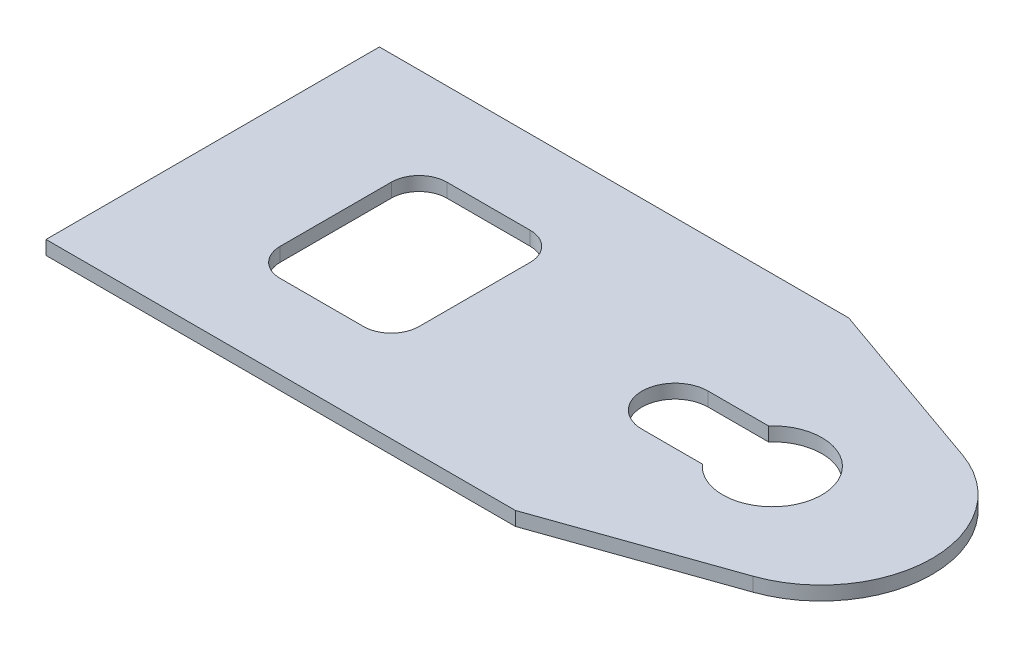
ISO-10303-21;
HEADER;
FILE_DESCRIPTION(('STEP AP214'),'2;1');
FILE_NAME('part.step','',(''),(''),'','','');
FILE_SCHEMA(('AUTOMOTIVE_DESIGN { 1 0 10303 214 1 1 1 1 }'));
ENDSEC;
DATA;
#1=APPLICATION_CONTEXT('core data for automotive mechanical design processes');
#2=APPLICATION_PROTOCOL_DEFINITION('international standard','automotive_design',2000,#1);
#3=PRODUCT_CONTEXT('',#1,'mechanical');
#4=PRODUCT('Part','Part','',(#3));
#5=PRODUCT_RELATED_PRODUCT_CATEGORY('part','',(#4));
#6=PRODUCT_DEFINITION_FORMATION('','',#4);
#7=PRODUCT_DEFINITION_CONTEXT('part definition',#1,'design');
#8=PRODUCT_DEFINITION('design','',#6,#7);
#9=PRODUCT_DEFINITION_SHAPE('','',#8);
#10=(LENGTH_UNIT() NAMED_UNIT(*) SI_UNIT(.MILLI.,.METRE.));
#11=(NAMED_UNIT(*) PLANE_ANGLE_UNIT() SI_UNIT($,.RADIAN.));
#12=(NAMED_UNIT(*) SI_UNIT($,.STERADIAN.) SOLID_ANGLE_UNIT());
#13=UNCERTAINTY_MEASURE_WITH_UNIT(LENGTH_MEASURE(1.E-05),#10,'distance_accuracy_value','');
#14=(GEOMETRIC_REPRESENTATION_CONTEXT(3) GLOBAL_UNCERTAINTY_ASSIGNED_CONTEXT((#13)) GLOBAL_UNIT_ASSIGNED_CONTEXT((#10,
#11,#12)) REPRESENTATION_CONTEXT('',''));
#15=CARTESIAN_POINT('',(0.,0.,0.));
#16=DIRECTION('',(0.,0.,1.));
#17=DIRECTION('',(1.,0.,0.));
#18=AXIS2_PLACEMENT_3D('',#15,#16,#17);
#19=CARTESIAN_POINT('',(1.07300918301274,0.,12.));
#20=DIRECTION('',(0.,0.,1.));
#21=DIRECTION('',(0.,1.,0.));
#22=AXIS2_PLACEMENT_3D('',#19,#20,#21);
#23=PLANE('',#22);
#24=DIRECTION('',(-1.,0.,0.));
#25=VECTOR('',#24,1.);
#26=CARTESIAN_POINT('',(2.07300918301273,1.00000000000002,12.));
#27=LINE('',#26,#25);
#28=CARTESIAN_POINT('',(-22.7831853071796,0.999999999999828,12.));
#29=VERTEX_POINT('',#28);
#30=CARTESIAN_POINT('',(11.,1.,12.));
#31=VERTEX_POINT('',#30);
#32=EDGE_CURVE('E292',#29,#31,#27,.F.);
#33=ORIENTED_EDGE('',*,*,#32,.F.);
#34=DIRECTION('',(0.,-1.,0.));
#35=VECTOR('',#34,1.);
#36=CARTESIAN_POINT('',(-22.7831853071796,-1.71786389540026E-13,12.));
#37=LINE('',#36,#35);
#38=CARTESIAN_POINT('',(-22.7831853071796,-1.71786389540026E-13,12.));
#39=VERTEX_POINT('',#38);
#40=EDGE_CURVE('E193',#29,#39,#37,.T.);
#41=ORIENTED_EDGE('',*,*,#40,.T.);
#42=DIRECTION('',(1.,0.,0.));
#43=VECTOR('',#42,1.);
#44=CARTESIAN_POINT('',(1.07300918301274,0.,12.));
#45=LINE('',#44,#43);
#46=CARTESIAN_POINT('',(11.,0.,12.));
#47=VERTEX_POINT('',#46);
#48=EDGE_CURVE('E13',#39,#47,#45,.T.);
#49=ORIENTED_EDGE('',*,*,#48,.T.);
#50=DIRECTION('',(0.,-1.,0.));
#51=VECTOR('',#50,1.);
#52=CARTESIAN_POINT('',(11.,1.,12.));
#53=LINE('',#52,#51);
#54=EDGE_CURVE('E190',#31,#47,#53,.T.);
#55=ORIENTED_EDGE('',*,*,#54,.F.);
#56=EDGE_LOOP('',(#33,#41,#49,#55));
#57=FACE_BOUND('',#56,.T.);
#58=ADVANCED_FACE('F63',(#57),#23,.T.);
#59=CARTESIAN_POINT('',(-18.9269908169873,-1.25796493264004E-13,-12.));
#60=DIRECTION('',(0.,0.,-1.));
#61=DIRECTION('',(0.,-1.,0.));
#62=AXIS2_PLACEMENT_3D('',#59,#60,#61);
#63=PLANE('',#62);
#64=DIRECTION('',(-1.,0.,0.));
#65=VECTOR('',#64,1.);
#66=CARTESIAN_POINT('',(-18.9269908169873,-1.2582553451969E-13,-12.));
#67=LINE('',#66,#65);
#68=CARTESIAN_POINT('',(11.,0.,-12.));
#69=VERTEX_POINT('',#68);
#70=CARTESIAN_POINT('',(-22.7831853071796,-1.71786389540026E-13,-12.));
#71=VERTEX_POINT('',#70);
#72=EDGE_CURVE('E72',#69,#71,#67,.T.);
#73=ORIENTED_EDGE('',*,*,#72,.T.);
#74=DIRECTION('',(0.,-1.,0.));
#75=VECTOR('',#74,1.);
#76=CARTESIAN_POINT('',(-22.7831853071796,-1.71786389540026E-13,-12.));
#77=LINE('',#76,#75);
#78=CARTESIAN_POINT('',(-22.7831853071796,0.999999999999828,-12.));
#79=VERTEX_POINT('',#78);
#80=EDGE_CURVE('E228',#79,#71,#77,.T.);
#81=ORIENTED_EDGE('',*,*,#80,.F.);
#82=DIRECTION('',(1.,0.,0.));
#83=VECTOR('',#82,1.);
#84=CARTESIAN_POINT('',(2.07300918301273,1.00000000000002,-12.));
#85=LINE('',#84,#83);
#86=CARTESIAN_POINT('',(11.,1.,-12.));
#87=VERTEX_POINT('',#86);
#88=EDGE_CURVE('E67',#87,#79,#85,.F.);
#89=ORIENTED_EDGE('',*,*,#88,.F.);
#90=DIRECTION('',(0.,-1.,0.));
#91=VECTOR('',#90,1.);
#92=CARTESIAN_POINT('',(11.,1.,-12.));
#93=LINE('',#92,#91);
#94=EDGE_CURVE('E231',#87,#69,#93,.T.);
#95=ORIENTED_EDGE('',*,*,#94,.T.);
#96=EDGE_LOOP('',(#73,#81,#89,#95));
#97=FACE_BOUND('',#96,.T.);
#98=ADVANCED_FACE('F304',(#97),#63,.T.);
#99=CARTESIAN_POINT('',(21.,0.,0.));
#100=DIRECTION('',(0.,-1.,0.));
#101=DIRECTION('',(0.,0.,-1.));
#102=AXIS2_PLACEMENT_3D('',#99,#100,#101);
#103=PLANE('',#102);
#104=CARTESIAN_POINT('',(-11.9269908169872,-1.45808412964008E-13,-4.));
#105=DIRECTION('',(0.,1.,0.));
#106=DIRECTION('',(1.,0.,0.));
#107=AXIS2_PLACEMENT_3D('',#104,#105,#106);
#108=CIRCLE('',#107,2.);
#109=CARTESIAN_POINT('',(-11.9269908169872,-1.45808412964008E-13,-6.));
#110=VERTEX_POINT('',#109);
#111=CARTESIAN_POINT('',(-13.9269908169872,-1.59947109980098E-13,-3.99999999999998));
#112=VERTEX_POINT('',#111);
#113=EDGE_CURVE('E232',#110,#112,#108,.T.);
#114=ORIENTED_EDGE('',*,*,#113,.T.);
#115=DIRECTION('',(0.,0.,1.));
#116=VECTOR('',#115,1.);
#117=CARTESIAN_POINT('',(-13.9269908169872,-1.59947109980098E-13,3.99999999999999));
#118=LINE('',#117,#116);
#119=CARTESIAN_POINT('',(-13.9269908169872,0.,3.99999999999999));
#120=VERTEX_POINT('',#119);
#121=EDGE_CURVE('E235',#112,#120,#118,.T.);
#122=ORIENTED_EDGE('',*,*,#121,.T.);
#123=CARTESIAN_POINT('',(-11.9269908169872,-1.45808412964008E-13,4.));
#124=DIRECTION('',(0.,1.,0.));
#125=DIRECTION('',(-1.,0.,0.));
#126=AXIS2_PLACEMENT_3D('',#123,#124,#125);
#127=CIRCLE('',#126,2.);
#128=CARTESIAN_POINT('',(-11.9269908169872,-1.45808412964008E-13,6.));
#129=VERTEX_POINT('',#128);
#130=EDGE_CURVE('E80',#120,#129,#127,.T.);
#131=ORIENTED_EDGE('',*,*,#130,.T.);
#132=DIRECTION('',(1.,0.,0.));
#133=VECTOR('',#132,1.);
#134=CARTESIAN_POINT('',(-11.9269908169872,-1.45808412964008E-13,6.));
#135=LINE('',#134,#133);
#136=CARTESIAN_POINT('',(-5.92699081698719,-1.04042843219227E-13,6.));
#137=VERTEX_POINT('',#136);
#138=EDGE_CURVE('E240',#129,#137,#135,.T.);
#139=ORIENTED_EDGE('',*,*,#138,.T.);
#140=CARTESIAN_POINT('',(-5.92699081698718,-1.04042843219227E-13,4.));
#141=DIRECTION('',(0.,1.,0.));
#142=DIRECTION('',(-1.,0.,0.));
#143=AXIS2_PLACEMENT_3D('',#140,#141,#142);
#144=CIRCLE('',#143,2.);
#145=CARTESIAN_POINT('',(-3.92699081698718,0.,3.99999999999999));
#146=VERTEX_POINT('',#145);
#147=EDGE_CURVE('E243',#137,#146,#144,.T.);
#148=ORIENTED_EDGE('',*,*,#147,.T.);
#149=DIRECTION('',(0.,0.,-1.));
#150=VECTOR('',#149,1.);
#151=CARTESIAN_POINT('',(-3.92699081698718,0.,3.99999999999999));
#152=LINE('',#151,#150);
#153=CARTESIAN_POINT('',(-3.92699081698718,0.,-3.99999999999998));
#154=VERTEX_POINT('',#153);
#155=EDGE_CURVE('E246',#146,#154,#152,.T.);
#156=ORIENTED_EDGE('',*,*,#155,.T.);
#157=CARTESIAN_POINT('',(-5.92699081698718,-1.04042843219227E-13,-4.));
#158=DIRECTION('',(0.,1.,0.));
#159=DIRECTION('',(-1.,0.,0.));
#160=AXIS2_PLACEMENT_3D('',#157,#158,#159);
#161=CIRCLE('',#160,2.);
#162=CARTESIAN_POINT('',(-5.92699081698719,-1.04042843219227E-13,-6.));
#163=VERTEX_POINT('',#162);
#164=EDGE_CURVE('E249',#154,#163,#161,.T.);
#165=ORIENTED_EDGE('',*,*,#164,.T.);
#166=DIRECTION('',(-1.,0.,0.));
#167=VECTOR('',#166,1.);
#168=CARTESIAN_POINT('',(-11.9269908169872,-1.45808412964008E-13,-6.));
#169=LINE('',#168,#167);
#170=EDGE_CURVE('E252',#163,#110,#169,.T.);
#171=ORIENTED_EDGE('',*,*,#170,.T.);
#172=EDGE_LOOP('',(#114,#122,#131,#139,#148,#156,#165,#171));
#173=FACE_BOUND('',#172,.T.);
#174=ORIENTED_EDGE('',*,*,#48,.F.);
#175=DIRECTION('',(0.,0.,1.));
#176=VECTOR('',#175,1.);
#177=CARTESIAN_POINT('',(-22.7831853071796,-1.71786389540026E-13,0.));
#178=LINE('',#177,#176);
#179=EDGE_CURVE('E226',#71,#39,#178,.T.);
#180=ORIENTED_EDGE('',*,*,#179,.F.);
#181=ORIENTED_EDGE('',*,*,#72,.F.);
#182=DIRECTION('',(-0.943295404303227,0.,-0.331954485163872));
#183=VECTOR('',#182,1.);
#184=CARTESIAN_POINT('',(11.,0.,-12.));
#185=LINE('',#184,#183);
#186=CARTESIAN_POINT('',(23.655635881311,0.,-7.54636323442582));
#187=VERTEX_POINT('',#186);
#188=EDGE_CURVE('E219',#187,#69,#185,.T.);
#189=ORIENTED_EDGE('',*,*,#188,.F.);
#190=CARTESIAN_POINT('',(21.,0.,0.));
#191=DIRECTION('',(0.,1.,0.));
#192=DIRECTION('',(0.,0.,-1.));
#193=AXIS2_PLACEMENT_3D('',#190,#191,#192);
#194=CIRCLE('',#193,8.);
#195=CARTESIAN_POINT('',(23.655635881311,0.,7.54636323442582));
#196=VERTEX_POINT('',#195);
#197=EDGE_CURVE('E209',#196,#187,#194,.T.);
#198=ORIENTED_EDGE('',*,*,#197,.F.);
#199=DIRECTION('',(0.943295404303227,0.,-0.331954485163872));
#200=VECTOR('',#199,1.);
#201=CARTESIAN_POINT('',(23.655635881311,0.,7.54636323442582));
#202=LINE('',#201,#200);
#203=EDGE_CURVE('E201',#47,#196,#202,.T.);
#204=ORIENTED_EDGE('',*,*,#203,.F.);
#205=EDGE_LOOP('',(#174,#180,#181,#189,#198,#204));
#206=FACE_BOUND('',#205,.T.);
#207=CARTESIAN_POINT('',(10.5,0.,0.));
#208=DIRECTION('',(0.,1.,0.));
#209=DIRECTION('',(0.,0.,1.));
#210=AXIS2_PLACEMENT_3D('',#207,#208,#209);
#211=CIRCLE('',#210,2.38);
#212=CARTESIAN_POINT('',(10.5,0.,-2.38));
#213=VERTEX_POINT('',#212);
#214=CARTESIAN_POINT('',(10.5,0.,2.38));
#215=VERTEX_POINT('',#214);
#216=EDGE_CURVE('E321',#213,#215,#211,.T.);
#217=ORIENTED_EDGE('',*,*,#216,.T.);
#218=DIRECTION('',(1.,0.,0.));
#219=VECTOR('',#218,1.);
#220=CARTESIAN_POINT('',(10.5,0.,2.38));
#221=LINE('',#220,#219);
#222=CARTESIAN_POINT('',(14.8390791067753,0.,2.38));
#223=VERTEX_POINT('',#222);
#224=EDGE_CURVE('E318',#215,#223,#221,.T.);
#225=ORIENTED_EDGE('',*,*,#224,.T.);
#226=CARTESIAN_POINT('',(17.5,0.,0.));
#227=DIRECTION('',(0.,1.,0.));
#228=DIRECTION('',(0.,0.,1.));
#229=AXIS2_PLACEMENT_3D('',#226,#227,#228);
#230=CIRCLE('',#229,3.57);
#231=CARTESIAN_POINT('',(14.8390791067753,0.,-2.38));
#232=VERTEX_POINT('',#231);
#233=EDGE_CURVE('E313',#223,#232,#230,.T.);
#234=ORIENTED_EDGE('',*,*,#233,.T.);
#235=DIRECTION('',(-1.,0.,0.));
#236=VECTOR('',#235,1.);
#237=CARTESIAN_POINT('',(10.5,0.,-2.38));
#238=LINE('',#237,#236);
#239=EDGE_CURVE('E310',#232,#213,#238,.T.);
#240=ORIENTED_EDGE('',*,*,#239,.T.);
#241=EDGE_LOOP('',(#217,#225,#234,#240));
#242=FACE_BOUND('',#241,.T.);
#243=ADVANCED_FACE('F65',(#173,#206,#242),#103,.T.);
#244=CARTESIAN_POINT('',(2.07300918301273,1.00000000000002,0.));
#245=DIRECTION('',(0.,-1.,0.));
#246=DIRECTION('',(1.,0.,0.));
#247=AXIS2_PLACEMENT_3D('',#244,#245,#246);
#248=PLANE('',#247);
#249=DIRECTION('',(0.,0.,1.));
#250=VECTOR('',#249,1.);
#251=CARTESIAN_POINT('',(-13.9269908169872,0.999999999999909,3.99999999999999));
#252=LINE('',#251,#250);
#253=CARTESIAN_POINT('',(-13.9269908169872,0.999999999999909,-3.99999999999998));
#254=VERTEX_POINT('',#253);
#255=CARTESIAN_POINT('',(-13.9269908169872,0.999999999999909,3.99999999999999));
#256=VERTEX_POINT('',#255);
#257=EDGE_CURVE('E257',#254,#256,#252,.T.);
#258=ORIENTED_EDGE('',*,*,#257,.F.);
#259=CARTESIAN_POINT('',(-11.9269908169872,0.999999999999923,-4.));
#260=DIRECTION('',(0.,1.,0.));
#261=DIRECTION('',(1.,0.,0.));
#262=AXIS2_PLACEMENT_3D('',#259,#260,#261);
#263=CIRCLE('',#262,2.);
#264=CARTESIAN_POINT('',(-11.9269908169872,0.999999999999923,-6.));
#265=VERTEX_POINT('',#264);
#266=EDGE_CURVE('E88',#265,#254,#263,.T.);
#267=ORIENTED_EDGE('',*,*,#266,.F.);
#268=DIRECTION('',(-1.,0.,0.));
#269=VECTOR('',#268,1.);
#270=CARTESIAN_POINT('',(-11.9269908169872,0.999999999999923,-6.));
#271=LINE('',#270,#269);
#272=CARTESIAN_POINT('',(-5.9269908169872,0.999999999999965,-6.));
#273=VERTEX_POINT('',#272);
#274=EDGE_CURVE('E236',#273,#265,#271,.T.);
#275=ORIENTED_EDGE('',*,*,#274,.F.);
#276=CARTESIAN_POINT('',(-5.92699081698718,0.999999999999965,-4.));
#277=DIRECTION('',(0.,1.,0.));
#278=DIRECTION('',(-1.,0.,0.));
#279=AXIS2_PLACEMENT_3D('',#276,#277,#278);
#280=CIRCLE('',#279,2.);
#281=CARTESIAN_POINT('',(-3.92699081698718,0.999999999999979,-3.99999999999998));
#282=VERTEX_POINT('',#281);
#283=EDGE_CURVE('E272',#282,#273,#280,.T.);
#284=ORIENTED_EDGE('',*,*,#283,.F.);
#285=DIRECTION('',(0.,0.,-1.));
#286=VECTOR('',#285,1.);
#287=CARTESIAN_POINT('',(-3.92699081698718,0.999999999999979,3.99999999999999));
#288=LINE('',#287,#286);
#289=CARTESIAN_POINT('',(-3.92699081698718,0.999999999999979,3.99999999999999));
#290=VERTEX_POINT('',#289);
#291=EDGE_CURVE('E269',#290,#282,#288,.T.);
#292=ORIENTED_EDGE('',*,*,#291,.F.);
#293=CARTESIAN_POINT('',(-5.92699081698718,0.999999999999965,4.));
#294=DIRECTION('',(0.,1.,0.));
#295=DIRECTION('',(-1.,0.,0.));
#296=AXIS2_PLACEMENT_3D('',#293,#294,#295);
#297=CIRCLE('',#296,2.);
#298=CARTESIAN_POINT('',(-5.9269908169872,0.999999999999965,6.));
#299=VERTEX_POINT('',#298);
#300=EDGE_CURVE('E266',#299,#290,#297,.T.);
#301=ORIENTED_EDGE('',*,*,#300,.F.);
#302=DIRECTION('',(1.,0.,0.));
#303=VECTOR('',#302,1.);
#304=CARTESIAN_POINT('',(-11.9269908169872,0.999999999999923,6.));
#305=LINE('',#304,#303);
#306=CARTESIAN_POINT('',(-11.9269908169872,0.999999999999923,6.));
#307=VERTEX_POINT('',#306);
#308=EDGE_CURVE('E263',#307,#299,#305,.T.);
#309=ORIENTED_EDGE('',*,*,#308,.F.);
#310=CARTESIAN_POINT('',(-11.9269908169872,0.999999999999923,4.));
#311=DIRECTION('',(0.,1.,0.));
#312=DIRECTION('',(-1.,0.,0.));
#313=AXIS2_PLACEMENT_3D('',#310,#311,#312);
#314=CIRCLE('',#313,2.);
#315=EDGE_CURVE('E260',#256,#307,#314,.T.);
#316=ORIENTED_EDGE('',*,*,#315,.F.);
#317=EDGE_LOOP('',(#258,#267,#275,#284,#292,#301,#309,#316));
#318=FACE_BOUND('',#317,.T.);
#319=ORIENTED_EDGE('',*,*,#88,.T.);
#320=DIRECTION('',(0.,0.,1.));
#321=VECTOR('',#320,1.);
#322=CARTESIAN_POINT('',(-22.7831853071796,0.999999999999828,0.));
#323=LINE('',#322,#321);
#324=EDGE_CURVE('E223',#79,#29,#323,.T.);
#325=ORIENTED_EDGE('',*,*,#324,.T.);
#326=ORIENTED_EDGE('',*,*,#32,.T.);
#327=DIRECTION('',(0.943295404303227,0.,-0.331954485163872));
#328=VECTOR('',#327,1.);
#329=CARTESIAN_POINT('',(23.655635881311,1.,7.54636323442582));
#330=LINE('',#329,#328);
#331=CARTESIAN_POINT('',(23.655635881311,1.,7.54636323442582));
#332=VERTEX_POINT('',#331);
#333=EDGE_CURVE('E203',#31,#332,#330,.T.);
#334=ORIENTED_EDGE('',*,*,#333,.T.);
#335=CARTESIAN_POINT('',(21.,1.,0.));
#336=DIRECTION('',(0.,1.,0.));
#337=DIRECTION('',(0.,0.,-1.));
#338=AXIS2_PLACEMENT_3D('',#335,#336,#337);
#339=CIRCLE('',#338,8.);
#340=CARTESIAN_POINT('',(23.655635881311,1.,-7.54636323442582));
#341=VERTEX_POINT('',#340);
#342=EDGE_CURVE('E325',#332,#341,#339,.T.);
#343=ORIENTED_EDGE('',*,*,#342,.T.);
#344=DIRECTION('',(-0.943295404303227,0.,-0.331954485163872));
#345=VECTOR('',#344,1.);
#346=CARTESIAN_POINT('',(11.,1.,-12.));
#347=LINE('',#346,#345);
#348=EDGE_CURVE('E300',#341,#87,#347,.T.);
#349=ORIENTED_EDGE('',*,*,#348,.T.);
#350=EDGE_LOOP('',(#319,#325,#326,#334,#343,#349));
#351=FACE_BOUND('',#350,.T.);
#352=DIRECTION('',(1.,0.,0.));
#353=VECTOR('',#352,1.);
#354=CARTESIAN_POINT('',(10.5,1.,2.38));
#355=LINE('',#354,#353);
#356=CARTESIAN_POINT('',(10.5,1.,2.38));
#357=VERTEX_POINT('',#356);
#358=CARTESIAN_POINT('',(14.8390791067753,1.,2.38));
#359=VERTEX_POINT('',#358);
#360=EDGE_CURVE('E331',#357,#359,#355,.T.);
#361=ORIENTED_EDGE('',*,*,#360,.F.);
#362=CARTESIAN_POINT('',(10.5,1.,0.));
#363=DIRECTION('',(0.,1.,0.));
#364=DIRECTION('',(0.,0.,1.));
#365=AXIS2_PLACEMENT_3D('',#362,#363,#364);
#366=CIRCLE('',#365,2.38);
#367=CARTESIAN_POINT('',(10.5,1.,-2.38));
#368=VERTEX_POINT('',#367);
#369=EDGE_CURVE('E336',#368,#357,#366,.T.);
#370=ORIENTED_EDGE('',*,*,#369,.F.);
#371=DIRECTION('',(-1.,0.,0.));
#372=VECTOR('',#371,1.);
#373=CARTESIAN_POINT('',(10.5,1.,-2.38));
#374=LINE('',#373,#372);
#375=CARTESIAN_POINT('',(14.8390791067753,1.,-2.38));
#376=VERTEX_POINT('',#375);
#377=EDGE_CURVE('E340',#376,#368,#374,.T.);
#378=ORIENTED_EDGE('',*,*,#377,.F.);
#379=CARTESIAN_POINT('',(17.5,1.,0.));
#380=DIRECTION('',(0.,1.,0.));
#381=DIRECTION('',(0.,0.,1.));
#382=AXIS2_PLACEMENT_3D('',#379,#380,#381);
#383=CIRCLE('',#382,3.57);
#384=EDGE_CURVE('E204',#359,#376,#383,.T.);
#385=ORIENTED_EDGE('',*,*,#384,.F.);
#386=EDGE_LOOP('',(#361,#370,#378,#385));
#387=FACE_BOUND('',#386,.T.);
#388=ADVANCED_FACE('F296',(#318,#351,#387),#248,.F.);
#389=CARTESIAN_POINT('',(-11.9269908169872,-1.45808412964008E-13,-4.));
#390=DIRECTION('',(0.,1.,0.));
#391=DIRECTION('',(-1.,0.,0.));
#392=AXIS2_PLACEMENT_3D('',#389,#390,#391);
#393=CYLINDRICAL_SURFACE('',#392,2.);
#394=ORIENTED_EDGE('',*,*,#266,.T.);
#395=DIRECTION('',(0.,1.,0.));
#396=VECTOR('',#395,1.);
#397=CARTESIAN_POINT('',(-13.9269908169872,-1.59947109980098E-13,-3.99999999999998));
#398=LINE('',#397,#396);
#399=EDGE_CURVE('E255',#112,#254,#398,.T.);
#400=ORIENTED_EDGE('',*,*,#399,.F.);
#401=ORIENTED_EDGE('',*,*,#113,.F.);
#402=DIRECTION('',(0.,1.,0.));
#403=VECTOR('',#402,1.);
#404=CARTESIAN_POINT('',(-11.9269908169872,-1.45808412964008E-13,-6.));
#405=LINE('',#404,#403);
#406=EDGE_CURVE('E277',#110,#265,#405,.T.);
#407=ORIENTED_EDGE('',*,*,#406,.T.);
#408=EDGE_LOOP('',(#394,#400,#401,#407));
#409=FACE_BOUND('',#408,.T.);
#410=ADVANCED_FACE('F377',(#409),#393,.F.);
#411=CARTESIAN_POINT('',(-11.9269908169872,-1.45808412964008E-13,-6.));
#412=DIRECTION('',(0.,0.,-1.));
#413=DIRECTION('',(-1.,0.,0.));
#414=AXIS2_PLACEMENT_3D('',#411,#412,#413);
#415=PLANE('',#414);
#416=ORIENTED_EDGE('',*,*,#274,.T.);
#417=ORIENTED_EDGE('',*,*,#406,.F.);
#418=ORIENTED_EDGE('',*,*,#170,.F.);
#419=DIRECTION('',(0.,1.,0.));
#420=VECTOR('',#419,1.);
#421=CARTESIAN_POINT('',(-5.92699081698719,-1.04042843219227E-13,-6.));
#422=LINE('',#421,#420);
#423=EDGE_CURVE('E279',#163,#273,#422,.T.);
#424=ORIENTED_EDGE('',*,*,#423,.T.);
#425=EDGE_LOOP('',(#416,#417,#418,#424));
#426=FACE_BOUND('',#425,.T.);
#427=ADVANCED_FACE('F381',(#426),#415,.F.);
#428=CARTESIAN_POINT('',(-5.92699081698718,-1.04042843219227E-13,-4.));
#429=DIRECTION('',(0.,1.,0.));
#430=DIRECTION('',(-1.,0.,0.));
#431=AXIS2_PLACEMENT_3D('',#428,#429,#430);
#432=CYLINDRICAL_SURFACE('',#431,2.);
#433=ORIENTED_EDGE('',*,*,#283,.T.);
#434=ORIENTED_EDGE('',*,*,#423,.F.);
#435=ORIENTED_EDGE('',*,*,#164,.F.);
#436=DIRECTION('',(0.,1.,0.));
#437=VECTOR('',#436,1.);
#438=CARTESIAN_POINT('',(-3.92699081698718,0.,-3.99999999999998));
#439=LINE('',#438,#437);
#440=EDGE_CURVE('E281',#154,#282,#439,.T.);
#441=ORIENTED_EDGE('',*,*,#440,.T.);
#442=EDGE_LOOP('',(#433,#434,#435,#441));
#443=FACE_BOUND('',#442,.T.);
#444=ADVANCED_FACE('F400',(#443),#432,.F.);
#445=CARTESIAN_POINT('',(-3.92699081698718,0.,3.99999999999999));
#446=DIRECTION('',(1.,0.,0.));
#447=DIRECTION('',(0.,1.,0.));
#448=AXIS2_PLACEMENT_3D('',#445,#446,#447);
#449=PLANE('',#448);
#450=ORIENTED_EDGE('',*,*,#291,.T.);
#451=ORIENTED_EDGE('',*,*,#440,.F.);
#452=ORIENTED_EDGE('',*,*,#155,.F.);
#453=DIRECTION('',(0.,1.,0.));
#454=VECTOR('',#453,1.);
#455=CARTESIAN_POINT('',(-3.92699081698718,0.,3.99999999999999));
#456=LINE('',#455,#454);
#457=EDGE_CURVE('E283',#146,#290,#456,.T.);
#458=ORIENTED_EDGE('',*,*,#457,.T.);
#459=EDGE_LOOP('',(#450,#451,#452,#458));
#460=FACE_BOUND('',#459,.T.);
#461=ADVANCED_FACE('F396',(#460),#449,.F.);
#462=CARTESIAN_POINT('',(-5.92699081698718,-1.04042843219227E-13,4.));
#463=DIRECTION('',(0.,1.,0.));
#464=DIRECTION('',(-1.,0.,0.));
#465=AXIS2_PLACEMENT_3D('',#462,#463,#464);
#466=CYLINDRICAL_SURFACE('',#465,2.);
#467=ORIENTED_EDGE('',*,*,#300,.T.);
#468=ORIENTED_EDGE('',*,*,#457,.F.);
#469=ORIENTED_EDGE('',*,*,#147,.F.);
#470=DIRECTION('',(0.,1.,0.));
#471=VECTOR('',#470,1.);
#472=CARTESIAN_POINT('',(-5.92699081698719,-1.04042843219227E-13,6.));
#473=LINE('',#472,#471);
#474=EDGE_CURVE('E285',#137,#299,#473,.T.);
#475=ORIENTED_EDGE('',*,*,#474,.T.);
#476=EDGE_LOOP('',(#467,#468,#469,#475));
#477=FACE_BOUND('',#476,.T.);
#478=ADVANCED_FACE('F392',(#477),#466,.F.);
#479=CARTESIAN_POINT('',(-11.9269908169872,-1.45808412964008E-13,6.));
#480=DIRECTION('',(0.,0.,1.));
#481=DIRECTION('',(1.,0.,0.));
#482=AXIS2_PLACEMENT_3D('',#479,#480,#481);
#483=PLANE('',#482);
#484=ORIENTED_EDGE('',*,*,#308,.T.);
#485=ORIENTED_EDGE('',*,*,#474,.F.);
#486=ORIENTED_EDGE('',*,*,#138,.F.);
#487=DIRECTION('',(0.,1.,0.));
#488=VECTOR('',#487,1.);
#489=CARTESIAN_POINT('',(-11.9269908169872,-1.45808412964008E-13,6.));
#490=LINE('',#489,#488);
#491=EDGE_CURVE('E287',#129,#307,#490,.T.);
#492=ORIENTED_EDGE('',*,*,#491,.T.);
#493=EDGE_LOOP('',(#484,#485,#486,#492));
#494=FACE_BOUND('',#493,.T.);
#495=ADVANCED_FACE('F389',(#494),#483,.F.);
#496=CARTESIAN_POINT('',(-11.9269908169872,-1.45808412964008E-13,4.));
#497=DIRECTION('',(0.,1.,0.));
#498=DIRECTION('',(-1.,0.,0.));
#499=AXIS2_PLACEMENT_3D('',#496,#497,#498);
#500=CYLINDRICAL_SURFACE('',#499,2.);
#501=ORIENTED_EDGE('',*,*,#315,.T.);
#502=ORIENTED_EDGE('',*,*,#491,.F.);
#503=ORIENTED_EDGE('',*,*,#130,.F.);
#504=DIRECTION('',(0.,1.,0.));
#505=VECTOR('',#504,1.);
#506=CARTESIAN_POINT('',(-13.9269908169872,-1.59947109980098E-13,3.99999999999999));
#507=LINE('',#506,#505);
#508=EDGE_CURVE('E289',#120,#256,#507,.T.);
#509=ORIENTED_EDGE('',*,*,#508,.T.);
#510=EDGE_LOOP('',(#501,#502,#503,#509));
#511=FACE_BOUND('',#510,.T.);
#512=ADVANCED_FACE('F385',(#511),#500,.F.);
#513=CARTESIAN_POINT('',(-13.9269908169872,-1.59947109980098E-13,3.99999999999999));
#514=DIRECTION('',(-1.,0.,0.));
#515=DIRECTION('',(0.,-1.,0.));
#516=AXIS2_PLACEMENT_3D('',#513,#514,#515);
#517=PLANE('',#516);
#518=ORIENTED_EDGE('',*,*,#257,.T.);
#519=ORIENTED_EDGE('',*,*,#508,.F.);
#520=ORIENTED_EDGE('',*,*,#121,.F.);
#521=ORIENTED_EDGE('',*,*,#399,.T.);
#522=EDGE_LOOP('',(#518,#519,#520,#521));
#523=FACE_BOUND('',#522,.T.);
#524=ADVANCED_FACE('F382',(#523),#517,.F.);
#525=CARTESIAN_POINT('',(-22.7831853071796,-1.71786389540026E-13,0.));
#526=DIRECTION('',(1.,0.,0.));
#527=DIRECTION('',(0.,0.,1.));
#528=AXIS2_PLACEMENT_3D('',#525,#526,#527);
#529=PLANE('',#528);
#530=ORIENTED_EDGE('',*,*,#40,.F.);
#531=ORIENTED_EDGE('',*,*,#324,.F.);
#532=ORIENTED_EDGE('',*,*,#80,.T.);
#533=ORIENTED_EDGE('',*,*,#179,.T.);
#534=EDGE_LOOP('',(#530,#531,#532,#533));
#535=FACE_BOUND('',#534,.T.);
#536=ADVANCED_FACE('F306',(#535),#529,.F.);
#537=CARTESIAN_POINT('',(11.,1.,-12.));
#538=DIRECTION('',(-0.331954485163872,0.,0.943295404303227));
#539=DIRECTION('',(0.943295404303227,0.,0.331954485163872));
#540=AXIS2_PLACEMENT_3D('',#537,#538,#539);
#541=PLANE('',#540);
#542=ORIENTED_EDGE('',*,*,#188,.T.);
#543=ORIENTED_EDGE('',*,*,#94,.F.);
#544=ORIENTED_EDGE('',*,*,#348,.F.);
#545=DIRECTION('',(0.,-1.,0.));
#546=VECTOR('',#545,1.);
#547=CARTESIAN_POINT('',(23.655635881311,1.,-7.54636323442582));
#548=LINE('',#547,#546);
#549=EDGE_CURVE('E216',#341,#187,#548,.T.);
#550=ORIENTED_EDGE('',*,*,#549,.T.);
#551=EDGE_LOOP('',(#542,#543,#544,#550));
#552=FACE_BOUND('',#551,.T.);
#553=ADVANCED_FACE('F308',(#552),#541,.F.);
#554=CARTESIAN_POINT('',(21.,1.,0.));
#555=DIRECTION('',(0.,-1.,0.));
#556=DIRECTION('',(0.,0.,-1.));
#557=AXIS2_PLACEMENT_3D('',#554,#555,#556);
#558=CYLINDRICAL_SURFACE('',#557,8.);
#559=ORIENTED_EDGE('',*,*,#197,.T.);
#560=ORIENTED_EDGE('',*,*,#549,.F.);
#561=ORIENTED_EDGE('',*,*,#342,.F.);
#562=DIRECTION('',(0.,-1.,0.));
#563=VECTOR('',#562,1.);
#564=CARTESIAN_POINT('',(23.655635881311,1.,7.54636323442582));
#565=LINE('',#564,#563);
#566=EDGE_CURVE('E210',#332,#196,#565,.T.);
#567=ORIENTED_EDGE('',*,*,#566,.T.);
#568=EDGE_LOOP('',(#559,#560,#561,#567));
#569=FACE_BOUND('',#568,.T.);
#570=ADVANCED_FACE('F412',(#569),#558,.T.);
#571=CARTESIAN_POINT('',(23.655635881311,1.,7.54636323442582));
#572=DIRECTION('',(-0.331954485163872,0.,-0.943295404303227));
#573=DIRECTION('',(-0.943295404303227,0.,0.331954485163872));
#574=AXIS2_PLACEMENT_3D('',#571,#572,#573);
#575=PLANE('',#574);
#576=ORIENTED_EDGE('',*,*,#203,.T.);
#577=ORIENTED_EDGE('',*,*,#566,.F.);
#578=ORIENTED_EDGE('',*,*,#333,.F.);
#579=ORIENTED_EDGE('',*,*,#54,.T.);
#580=EDGE_LOOP('',(#576,#577,#578,#579));
#581=FACE_BOUND('',#580,.T.);
#582=ADVANCED_FACE('F199',(#581),#575,.F.);
#583=CARTESIAN_POINT('',(17.5,0.,0.));
#584=DIRECTION('',(0.,1.,0.));
#585=DIRECTION('',(0.,0.,1.));
#586=AXIS2_PLACEMENT_3D('',#583,#584,#585);
#587=CYLINDRICAL_SURFACE('',#586,3.57);
#588=ORIENTED_EDGE('',*,*,#384,.T.);
#589=DIRECTION('',(0.,1.,0.));
#590=VECTOR('',#589,1.);
#591=CARTESIAN_POINT('',(14.8390791067753,0.,-2.38));
#592=LINE('',#591,#590);
#593=EDGE_CURVE('E338',#232,#376,#592,.T.);
#594=ORIENTED_EDGE('',*,*,#593,.F.);
#595=ORIENTED_EDGE('',*,*,#233,.F.);
#596=DIRECTION('',(0.,1.,0.));
#597=VECTOR('',#596,1.);
#598=CARTESIAN_POINT('',(14.8390791067753,0.,2.38));
#599=LINE('',#598,#597);
#600=EDGE_CURVE('E343',#223,#359,#599,.T.);
#601=ORIENTED_EDGE('',*,*,#600,.T.);
#602=EDGE_LOOP('',(#588,#594,#595,#601));
#603=FACE_BOUND('',#602,.T.);
#604=ADVANCED_FACE('F348',(#603),#587,.F.);
#605=CARTESIAN_POINT('',(10.5,0.,-2.38));
#606=DIRECTION('',(0.,0.,-1.));
#607=DIRECTION('',(-1.,0.,0.));
#608=AXIS2_PLACEMENT_3D('',#605,#606,#607);
#609=PLANE('',#608);
#610=ORIENTED_EDGE('',*,*,#377,.T.);
#611=DIRECTION('',(0.,1.,0.));
#612=VECTOR('',#611,1.);
#613=CARTESIAN_POINT('',(10.5,0.,-2.38));
#614=LINE('',#613,#612);
#615=EDGE_CURVE('E334',#213,#368,#614,.T.);
#616=ORIENTED_EDGE('',*,*,#615,.F.);
#617=ORIENTED_EDGE('',*,*,#239,.F.);
#618=ORIENTED_EDGE('',*,*,#593,.T.);
#619=EDGE_LOOP('',(#610,#616,#617,#618));
#620=FACE_BOUND('',#619,.T.);
#621=ADVANCED_FACE('F354',(#620),#609,.F.);
#622=CARTESIAN_POINT('',(10.5,0.,0.));
#623=DIRECTION('',(0.,1.,0.));
#624=DIRECTION('',(0.,0.,1.));
#625=AXIS2_PLACEMENT_3D('',#622,#623,#624);
#626=CYLINDRICAL_SURFACE('',#625,2.38);
#627=ORIENTED_EDGE('',*,*,#369,.T.);
#628=DIRECTION('',(0.,1.,0.));
#629=VECTOR('',#628,1.);
#630=CARTESIAN_POINT('',(10.5,0.,2.38));
#631=LINE('',#630,#629);
#632=EDGE_CURVE('E328',#215,#357,#631,.T.);
#633=ORIENTED_EDGE('',*,*,#632,.F.);
#634=ORIENTED_EDGE('',*,*,#216,.F.);
#635=ORIENTED_EDGE('',*,*,#615,.T.);
#636=EDGE_LOOP('',(#627,#633,#634,#635));
#637=FACE_BOUND('',#636,.T.);
#638=ADVANCED_FACE('F360',(#637),#626,.F.);
#639=CARTESIAN_POINT('',(10.5,0.,2.38));
#640=DIRECTION('',(0.,0.,1.));
#641=DIRECTION('',(1.,0.,0.));
#642=AXIS2_PLACEMENT_3D('',#639,#640,#641);
#643=PLANE('',#642);
#644=ORIENTED_EDGE('',*,*,#360,.T.);
#645=ORIENTED_EDGE('',*,*,#600,.F.);
#646=ORIENTED_EDGE('',*,*,#224,.F.);
#647=ORIENTED_EDGE('',*,*,#632,.T.);
#648=EDGE_LOOP('',(#644,#645,#646,#647));
#649=FACE_BOUND('',#648,.T.);
#650=ADVANCED_FACE('F358',(#649),#643,.F.);
#651=CLOSED_SHELL('',(#58,#98,#243,#388,#410,#427,#444,#461,#478,#495,#512,#524,#536,#553,#570,
#582,#604,#621,#638,#650));
#652=MANIFOLD_SOLID_BREP('B2',#651);
#653=ADVANCED_BREP_SHAPE_REPRESENTATION('',(#18,#652),#14);
#654=SHAPE_DEFINITION_REPRESENTATION(#9,#653);
ENDSEC;
END-ISO-10303-21;
